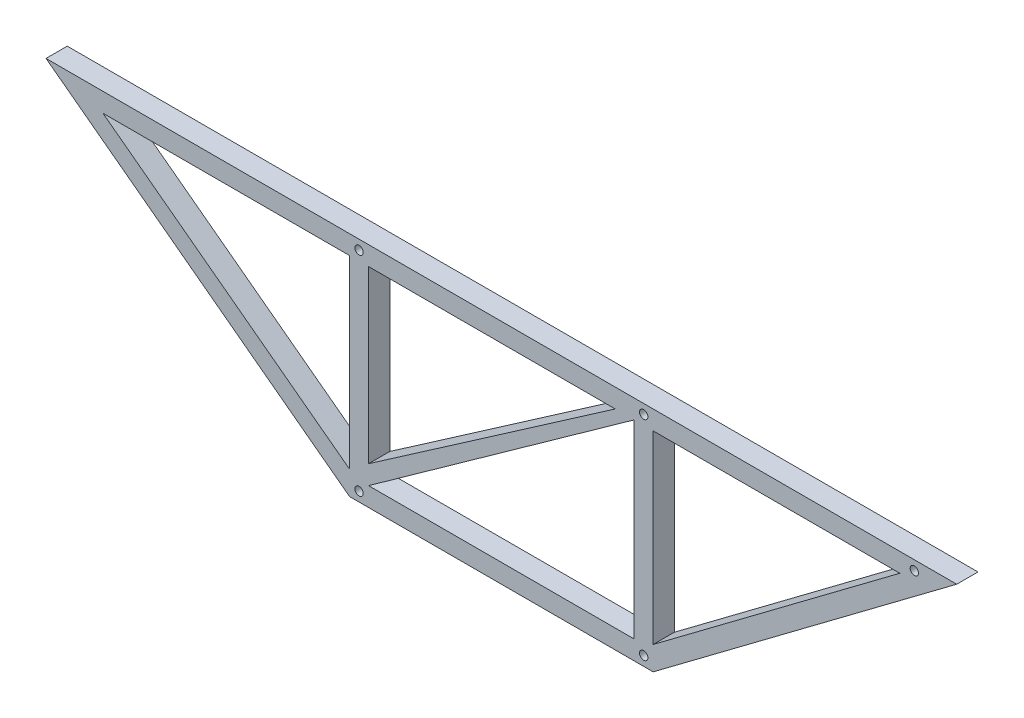
ISO-10303-21;
HEADER;
FILE_DESCRIPTION(('STEP AP214'),'2;1');
FILE_NAME('part.step','',(''),(''),'','','');
FILE_SCHEMA(('AUTOMOTIVE_DESIGN { 1 0 10303 214 1 1 1 1 }'));
ENDSEC;
DATA;
#1=APPLICATION_CONTEXT('core data for automotive mechanical design processes');
#2=APPLICATION_PROTOCOL_DEFINITION('international standard','automotive_design',2000,#1);
#3=PRODUCT_CONTEXT('',#1,'mechanical');
#4=PRODUCT('Part','Part','',(#3));
#5=PRODUCT_RELATED_PRODUCT_CATEGORY('part','',(#4));
#6=PRODUCT_DEFINITION_FORMATION('','',#4);
#7=PRODUCT_DEFINITION_CONTEXT('part definition',#1,'design');
#8=PRODUCT_DEFINITION('design','',#6,#7);
#9=PRODUCT_DEFINITION_SHAPE('','',#8);
#10=(LENGTH_UNIT() NAMED_UNIT(*) SI_UNIT(.MILLI.,.METRE.));
#11=(NAMED_UNIT(*) PLANE_ANGLE_UNIT() SI_UNIT($,.RADIAN.));
#12=(NAMED_UNIT(*) SI_UNIT($,.STERADIAN.) SOLID_ANGLE_UNIT());
#13=UNCERTAINTY_MEASURE_WITH_UNIT(LENGTH_MEASURE(1.E-05),#10,'distance_accuracy_value','');
#14=(GEOMETRIC_REPRESENTATION_CONTEXT(3) GLOBAL_UNCERTAINTY_ASSIGNED_CONTEXT((#13)) GLOBAL_UNIT_ASSIGNED_CONTEXT((#10,
#11,#12)) REPRESENTATION_CONTEXT('',''));
#15=CARTESIAN_POINT('',(0.,0.,0.));
#16=DIRECTION('',(0.,0.,1.));
#17=DIRECTION('',(1.,0.,0.));
#18=AXIS2_PLACEMENT_3D('',#15,#16,#17);
#19=CARTESIAN_POINT('',(200.,-300.,14.));
#20=DIRECTION('',(-0.6,0.8,0.));
#21=DIRECTION('',(-0.8,-0.6,0.));
#22=AXIS2_PLACEMENT_3D('',#19,#20,#21);
#23=PLANE('',#22);
#24=DIRECTION('',(0.8,0.6,0.));
#25=VECTOR('',#24,1.);
#26=CARTESIAN_POINT('',(200.,-300.,-14.));
#27=LINE('',#26,#25);
#28=CARTESIAN_POINT('',(200.,-300.,-14.));
#29=VERTEX_POINT('',#28);
#30=CARTESIAN_POINT('',(600.,0.,-14.));
#31=VERTEX_POINT('',#30);
#32=EDGE_CURVE('E292',#29,#31,#27,.T.);
#33=ORIENTED_EDGE('',*,*,#32,.T.);
#34=DIRECTION('',(0.,0.,-1.));
#35=VECTOR('',#34,1.);
#36=CARTESIAN_POINT('',(600.,0.,14.));
#37=LINE('',#36,#35);
#38=CARTESIAN_POINT('',(600.,0.,14.));
#39=VERTEX_POINT('',#38);
#40=EDGE_CURVE('E11',#39,#31,#37,.T.);
#41=ORIENTED_EDGE('',*,*,#40,.F.);
#42=DIRECTION('',(0.8,0.6,0.));
#43=VECTOR('',#42,1.);
#44=CARTESIAN_POINT('',(200.,-300.,14.));
#45=LINE('',#44,#43);
#46=CARTESIAN_POINT('',(200.,-300.,14.));
#47=VERTEX_POINT('',#46);
#48=EDGE_CURVE('E297',#47,#39,#45,.T.);
#49=ORIENTED_EDGE('',*,*,#48,.F.);
#50=DIRECTION('',(0.,0.,-1.));
#51=VECTOR('',#50,1.);
#52=CARTESIAN_POINT('',(200.,-300.,14.));
#53=LINE('',#52,#51);
#54=EDGE_CURVE('E315',#47,#29,#53,.T.);
#55=ORIENTED_EDGE('',*,*,#54,.T.);
#56=EDGE_LOOP('',(#33,#41,#49,#55));
#57=FACE_BOUND('',#56,.T.);
#58=ADVANCED_FACE('F44',(#57),#23,.F.);
#59=CARTESIAN_POINT('',(-600.,0.,14.));
#60=DIRECTION('',(0.,-1.,0.));
#61=DIRECTION('',(0.,0.,-1.));
#62=AXIS2_PLACEMENT_3D('',#59,#60,#61);
#63=PLANE('',#62);
#64=DIRECTION('',(-1.,0.,0.));
#65=VECTOR('',#64,1.);
#66=CARTESIAN_POINT('',(-600.,0.,-14.));
#67=LINE('',#66,#65);
#68=CARTESIAN_POINT('',(-600.,0.,-14.));
#69=VERTEX_POINT('',#68);
#70=EDGE_CURVE('E316',#31,#69,#67,.T.);
#71=ORIENTED_EDGE('',*,*,#70,.T.);
#72=DIRECTION('',(0.,0.,-1.));
#73=VECTOR('',#72,1.);
#74=CARTESIAN_POINT('',(-600.,0.,14.));
#75=LINE('',#74,#73);
#76=CARTESIAN_POINT('',(-600.,0.,14.));
#77=VERTEX_POINT('',#76);
#78=EDGE_CURVE('E52',#77,#69,#75,.T.);
#79=ORIENTED_EDGE('',*,*,#78,.F.);
#80=DIRECTION('',(-1.,0.,0.));
#81=VECTOR('',#80,1.);
#82=CARTESIAN_POINT('',(-600.,0.,14.));
#83=LINE('',#82,#81);
#84=EDGE_CURVE('E304',#39,#77,#83,.T.);
#85=ORIENTED_EDGE('',*,*,#84,.F.);
#86=ORIENTED_EDGE('',*,*,#40,.T.);
#87=EDGE_LOOP('',(#71,#79,#85,#86));
#88=FACE_BOUND('',#87,.T.);
#89=ADVANCED_FACE('F353',(#88),#63,.F.);
#90=CARTESIAN_POINT('',(-600.,0.,14.));
#91=DIRECTION('',(0.6,0.8,0.));
#92=DIRECTION('',(-0.8,0.6,0.));
#93=AXIS2_PLACEMENT_3D('',#90,#91,#92);
#94=PLANE('',#93);
#95=DIRECTION('',(0.8,-0.6,0.));
#96=VECTOR('',#95,1.);
#97=CARTESIAN_POINT('',(-600.,0.,-14.));
#98=LINE('',#97,#96);
#99=CARTESIAN_POINT('',(-200.,-300.,-14.));
#100=VERTEX_POINT('',#99);
#101=EDGE_CURVE('E317',#69,#100,#98,.T.);
#102=ORIENTED_EDGE('',*,*,#101,.T.);
#103=DIRECTION('',(0.,0.,-1.));
#104=VECTOR('',#103,1.);
#105=CARTESIAN_POINT('',(-200.,-300.,14.));
#106=LINE('',#105,#104);
#107=CARTESIAN_POINT('',(-200.,-300.,14.));
#108=VERTEX_POINT('',#107);
#109=EDGE_CURVE('E330',#108,#100,#106,.T.);
#110=ORIENTED_EDGE('',*,*,#109,.F.);
#111=DIRECTION('',(0.8,-0.6,0.));
#112=VECTOR('',#111,1.);
#113=CARTESIAN_POINT('',(-600.,0.,14.));
#114=LINE('',#113,#112);
#115=EDGE_CURVE('E308',#77,#108,#114,.T.);
#116=ORIENTED_EDGE('',*,*,#115,.F.);
#117=ORIENTED_EDGE('',*,*,#78,.T.);
#118=EDGE_LOOP('',(#102,#110,#116,#117));
#119=FACE_BOUND('',#118,.T.);
#120=ADVANCED_FACE('F338',(#119),#94,.F.);
#121=CARTESIAN_POINT('',(-200.,-300.,14.));
#122=DIRECTION('',(0.,1.,0.));
#123=DIRECTION('',(0.,0.,1.));
#124=AXIS2_PLACEMENT_3D('',#121,#122,#123);
#125=PLANE('',#124);
#126=DIRECTION('',(1.,0.,0.));
#127=VECTOR('',#126,1.);
#128=CARTESIAN_POINT('',(-200.,-300.,-14.));
#129=LINE('',#128,#127);
#130=EDGE_CURVE('E302',#100,#29,#129,.T.);
#131=ORIENTED_EDGE('',*,*,#130,.T.);
#132=ORIENTED_EDGE('',*,*,#54,.F.);
#133=DIRECTION('',(1.,0.,0.));
#134=VECTOR('',#133,1.);
#135=CARTESIAN_POINT('',(-200.,-300.,14.));
#136=LINE('',#135,#134);
#137=EDGE_CURVE('E310',#108,#47,#136,.T.);
#138=ORIENTED_EDGE('',*,*,#137,.F.);
#139=ORIENTED_EDGE('',*,*,#109,.T.);
#140=EDGE_LOOP('',(#131,#132,#138,#139));
#141=FACE_BOUND('',#140,.T.);
#142=ADVANCED_FACE('F345',(#141),#125,.F.);
#143=CARTESIAN_POINT('',(0.,0.,14.));
#144=DIRECTION('',(0.,0.,-1.));
#145=DIRECTION('',(-1.,0.,0.));
#146=AXIS2_PLACEMENT_3D('',#143,#144,#145);
#147=PLANE('',#146);
#148=CARTESIAN_POINT('',(544.11011125979,-12.5,14.));
#149=DIRECTION('',(0.,0.,1.));
#150=DIRECTION('',(1.,0.,0.));
#151=AXIS2_PLACEMENT_3D('',#148,#149,#150);
#152=CIRCLE('',#151,5.49999999999996);
#153=CARTESIAN_POINT('',(549.61011125979,-12.5,14.));
#154=VERTEX_POINT('',#153);
#155=EDGE_CURVE('E464',#154,#154,#152,.T.);
#156=ORIENTED_EDGE('',*,*,#155,.F.);
#157=EDGE_LOOP('',(#156));
#158=FACE_BOUND('',#157,.T.);
#159=CARTESIAN_POINT('',(187.5,-12.5,14.));
#160=DIRECTION('',(0.,0.,1.));
#161=DIRECTION('',(1.,0.,0.));
#162=AXIS2_PLACEMENT_3D('',#159,#160,#161);
#163=CIRCLE('',#162,5.50000000000002);
#164=CARTESIAN_POINT('',(193.,-12.5,14.));
#165=VERTEX_POINT('',#164);
#166=EDGE_CURVE('E455',#165,#165,#163,.T.);
#167=ORIENTED_EDGE('',*,*,#166,.F.);
#168=EDGE_LOOP('',(#167));
#169=FACE_BOUND('',#168,.T.);
#170=CARTESIAN_POINT('',(187.5,-287.5,14.));
#171=DIRECTION('',(0.,0.,1.));
#172=DIRECTION('',(1.,0.,0.));
#173=AXIS2_PLACEMENT_3D('',#170,#171,#172);
#174=CIRCLE('',#173,5.50000000000002);
#175=CARTESIAN_POINT('',(193.,-287.5,14.));
#176=VERTEX_POINT('',#175);
#177=EDGE_CURVE('E441',#176,#176,#174,.T.);
#178=ORIENTED_EDGE('',*,*,#177,.F.);
#179=EDGE_LOOP('',(#178));
#180=FACE_BOUND('',#179,.T.);
#181=CARTESIAN_POINT('',(-187.5,-287.5,14.));
#182=DIRECTION('',(0.,0.,1.));
#183=DIRECTION('',(1.,0.,0.));
#184=AXIS2_PLACEMENT_3D('',#181,#182,#183);
#185=CIRCLE('',#184,5.50000000000002);
#186=CARTESIAN_POINT('',(-182.,-287.5,14.));
#187=VERTEX_POINT('',#186);
#188=EDGE_CURVE('E440',#187,#187,#185,.T.);
#189=ORIENTED_EDGE('',*,*,#188,.F.);
#190=EDGE_LOOP('',(#189));
#191=FACE_BOUND('',#190,.T.);
#192=CARTESIAN_POINT('',(-187.5,-12.5,14.));
#193=DIRECTION('',(0.,0.,1.));
#194=DIRECTION('',(1.,0.,0.));
#195=AXIS2_PLACEMENT_3D('',#192,#193,#194);
#196=CIRCLE('',#195,5.50000000000002);
#197=CARTESIAN_POINT('',(-182.,-12.5,14.));
#198=VERTEX_POINT('',#197);
#199=EDGE_CURVE('E181',#198,#198,#196,.T.);
#200=ORIENTED_EDGE('',*,*,#199,.F.);
#201=EDGE_LOOP('',(#200));
#202=FACE_BOUND('',#201,.T.);
#203=DIRECTION('',(0.8,0.6,0.));
#204=VECTOR('',#203,1.);
#205=CARTESIAN_POINT('',(525.,-25.,14.));
#206=LINE('',#205,#204);
#207=CARTESIAN_POINT('',(200.,-268.75,14.));
#208=VERTEX_POINT('',#207);
#209=CARTESIAN_POINT('',(525.,-25.,14.));
#210=VERTEX_POINT('',#209);
#211=EDGE_CURVE('E176',#208,#210,#206,.T.);
#212=ORIENTED_EDGE('',*,*,#211,.F.);
#213=DIRECTION('',(0.,-1.,0.));
#214=VECTOR('',#213,1.);
#215=CARTESIAN_POINT('',(200.,-268.75,14.));
#216=LINE('',#215,#214);
#217=CARTESIAN_POINT('',(200.,-25.,14.));
#218=VERTEX_POINT('',#217);
#219=EDGE_CURVE('E58',#218,#208,#216,.T.);
#220=ORIENTED_EDGE('',*,*,#219,.F.);
#221=DIRECTION('',(-1.,0.,0.));
#222=VECTOR('',#221,1.);
#223=CARTESIAN_POINT('',(200.,-25.,14.));
#224=LINE('',#223,#222);
#225=EDGE_CURVE('E178',#210,#218,#224,.T.);
#226=ORIENTED_EDGE('',*,*,#225,.F.);
#227=EDGE_LOOP('',(#212,#220,#226));
#228=FACE_BOUND('',#227,.T.);
#229=DIRECTION('',(0.,1.,0.));
#230=VECTOR('',#229,1.);
#231=CARTESIAN_POINT('',(-200.,-25.,14.));
#232=LINE('',#231,#230);
#233=CARTESIAN_POINT('',(-200.,-268.75,14.));
#234=VERTEX_POINT('',#233);
#235=CARTESIAN_POINT('',(-200.,-25.,14.));
#236=VERTEX_POINT('',#235);
#237=EDGE_CURVE('E214',#234,#236,#232,.T.);
#238=ORIENTED_EDGE('',*,*,#237,.F.);
#239=DIRECTION('',(0.8,-0.6,0.));
#240=VECTOR('',#239,1.);
#241=CARTESIAN_POINT('',(-200.,-268.75,14.));
#242=LINE('',#241,#240);
#243=CARTESIAN_POINT('',(-525.,-25.,14.));
#244=VERTEX_POINT('',#243);
#245=EDGE_CURVE('E198',#244,#234,#242,.T.);
#246=ORIENTED_EDGE('',*,*,#245,.F.);
#247=DIRECTION('',(-1.,0.,0.));
#248=VECTOR('',#247,1.);
#249=CARTESIAN_POINT('',(-525.,-25.,14.));
#250=LINE('',#249,#248);
#251=EDGE_CURVE('E204',#236,#244,#250,.T.);
#252=ORIENTED_EDGE('',*,*,#251,.F.);
#253=EDGE_LOOP('',(#238,#246,#252));
#254=FACE_BOUND('',#253,.T.);
#255=DIRECTION('',(0.,-1.,0.));
#256=VECTOR('',#255,1.);
#257=CARTESIAN_POINT('',(-175.,-25.,14.));
#258=LINE('',#257,#256);
#259=CARTESIAN_POINT('',(-175.,-25.,14.));
#260=VERTEX_POINT('',#259);
#261=CARTESIAN_POINT('',(-175.,-250.,14.));
#262=VERTEX_POINT('',#261);
#263=EDGE_CURVE('E248',#260,#262,#258,.T.);
#264=ORIENTED_EDGE('',*,*,#263,.F.);
#265=DIRECTION('',(-1.,0.,0.));
#266=VECTOR('',#265,1.);
#267=CARTESIAN_POINT('',(-175.,-25.,14.));
#268=LINE('',#267,#266);
#269=CARTESIAN_POINT('',(150.,-25.,14.));
#270=VERTEX_POINT('',#269);
#271=EDGE_CURVE('E253',#270,#260,#268,.T.);
#272=ORIENTED_EDGE('',*,*,#271,.F.);
#273=DIRECTION('',(0.822192191643779,0.569209978830308,0.));
#274=VECTOR('',#273,1.);
#275=CARTESIAN_POINT('',(150.,-25.,14.));
#276=LINE('',#275,#274);
#277=EDGE_CURVE('E244',#262,#270,#276,.T.);
#278=ORIENTED_EDGE('',*,*,#277,.F.);
#279=EDGE_LOOP('',(#264,#272,#278));
#280=FACE_BOUND('',#279,.T.);
#281=DIRECTION('',(1.,0.,0.));
#282=VECTOR('',#281,1.);
#283=CARTESIAN_POINT('',(-175.,-275.,14.));
#284=LINE('',#283,#282);
#285=CARTESIAN_POINT('',(-175.,-275.,14.));
#286=VERTEX_POINT('',#285);
#287=CARTESIAN_POINT('',(175.,-275.,14.));
#288=VERTEX_POINT('',#287);
#289=EDGE_CURVE('E283',#286,#288,#284,.T.);
#290=ORIENTED_EDGE('',*,*,#289,.F.);
#291=DIRECTION('',(-0.813733471206735,-0.581238193719096,0.));
#292=VECTOR('',#291,1.);
#293=CARTESIAN_POINT('',(175.,-25.,14.));
#294=LINE('',#293,#292);
#295=CARTESIAN_POINT('',(175.,-25.,14.));
#296=VERTEX_POINT('',#295);
#297=EDGE_CURVE('E255',#296,#286,#294,.T.);
#298=ORIENTED_EDGE('',*,*,#297,.F.);
#299=DIRECTION('',(0.,1.,0.));
#300=VECTOR('',#299,1.);
#301=CARTESIAN_POINT('',(175.,-275.,14.));
#302=LINE('',#301,#300);
#303=EDGE_CURVE('E269',#288,#296,#302,.T.);
#304=ORIENTED_EDGE('',*,*,#303,.F.);
#305=EDGE_LOOP('',(#290,#298,#304));
#306=FACE_BOUND('',#305,.T.);
#307=ORIENTED_EDGE('',*,*,#48,.T.);
#308=ORIENTED_EDGE('',*,*,#84,.T.);
#309=ORIENTED_EDGE('',*,*,#115,.T.);
#310=ORIENTED_EDGE('',*,*,#137,.T.);
#311=EDGE_LOOP('',(#307,#308,#309,#310));
#312=FACE_BOUND('',#311,.T.);
#313=ADVANCED_FACE('F348',(#158,#169,#180,#191,#202,#228,#254,#280,#306,#312),#147,.F.);
#314=CARTESIAN_POINT('',(0.,0.,-14.));
#315=DIRECTION('',(0.,0.,-1.));
#316=DIRECTION('',(-1.,0.,0.));
#317=AXIS2_PLACEMENT_3D('',#314,#315,#316);
#318=PLANE('',#317);
#319=CARTESIAN_POINT('',(544.11011125979,-12.5,-14.));
#320=DIRECTION('',(0.,0.,1.));
#321=DIRECTION('',(1.,0.,0.));
#322=AXIS2_PLACEMENT_3D('',#319,#320,#321);
#323=CIRCLE('',#322,5.49999999999996);
#324=CARTESIAN_POINT('',(549.61011125979,-12.5,-14.));
#325=VERTEX_POINT('',#324);
#326=EDGE_CURVE('E468',#325,#325,#323,.T.);
#327=ORIENTED_EDGE('',*,*,#326,.T.);
#328=EDGE_LOOP('',(#327));
#329=FACE_BOUND('',#328,.T.);
#330=CARTESIAN_POINT('',(187.5,-12.5,-14.));
#331=DIRECTION('',(0.,0.,1.));
#332=DIRECTION('',(1.,0.,0.));
#333=AXIS2_PLACEMENT_3D('',#330,#331,#332);
#334=CIRCLE('',#333,5.50000000000002);
#335=CARTESIAN_POINT('',(193.,-12.5,-14.));
#336=VERTEX_POINT('',#335);
#337=EDGE_CURVE('E456',#336,#336,#334,.T.);
#338=ORIENTED_EDGE('',*,*,#337,.T.);
#339=EDGE_LOOP('',(#338));
#340=FACE_BOUND('',#339,.T.);
#341=CARTESIAN_POINT('',(187.5,-287.5,-14.));
#342=DIRECTION('',(0.,0.,1.));
#343=DIRECTION('',(1.,0.,0.));
#344=AXIS2_PLACEMENT_3D('',#341,#342,#343);
#345=CIRCLE('',#344,5.50000000000002);
#346=CARTESIAN_POINT('',(193.,-287.5,-14.));
#347=VERTEX_POINT('',#346);
#348=EDGE_CURVE('E446',#347,#347,#345,.T.);
#349=ORIENTED_EDGE('',*,*,#348,.T.);
#350=EDGE_LOOP('',(#349));
#351=FACE_BOUND('',#350,.T.);
#352=CARTESIAN_POINT('',(-187.5,-287.5,-14.));
#353=DIRECTION('',(0.,0.,1.));
#354=DIRECTION('',(1.,0.,0.));
#355=AXIS2_PLACEMENT_3D('',#352,#353,#354);
#356=CIRCLE('',#355,5.50000000000002);
#357=CARTESIAN_POINT('',(-182.,-287.5,-14.));
#358=VERTEX_POINT('',#357);
#359=EDGE_CURVE('E432',#358,#358,#356,.T.);
#360=ORIENTED_EDGE('',*,*,#359,.T.);
#361=EDGE_LOOP('',(#360));
#362=FACE_BOUND('',#361,.T.);
#363=CARTESIAN_POINT('',(-187.5,-12.5,-14.));
#364=DIRECTION('',(0.,0.,1.));
#365=DIRECTION('',(1.,0.,0.));
#366=AXIS2_PLACEMENT_3D('',#363,#364,#365);
#367=CIRCLE('',#366,5.50000000000002);
#368=CARTESIAN_POINT('',(-182.,-12.5,-14.));
#369=VERTEX_POINT('',#368);
#370=EDGE_CURVE('E186',#369,#369,#367,.T.);
#371=ORIENTED_EDGE('',*,*,#370,.T.);
#372=EDGE_LOOP('',(#371));
#373=FACE_BOUND('',#372,.T.);
#374=DIRECTION('',(0.,-1.,0.));
#375=VECTOR('',#374,1.);
#376=CARTESIAN_POINT('',(200.,-268.75,-14.));
#377=LINE('',#376,#375);
#378=CARTESIAN_POINT('',(200.,-25.,-14.));
#379=VERTEX_POINT('',#378);
#380=CARTESIAN_POINT('',(200.,-268.75,-14.));
#381=VERTEX_POINT('',#380);
#382=EDGE_CURVE('E159',#379,#381,#377,.T.);
#383=ORIENTED_EDGE('',*,*,#382,.T.);
#384=DIRECTION('',(0.8,0.6,0.));
#385=VECTOR('',#384,1.);
#386=CARTESIAN_POINT('',(525.,-25.,-14.));
#387=LINE('',#386,#385);
#388=CARTESIAN_POINT('',(525.,-25.,-14.));
#389=VERTEX_POINT('',#388);
#390=EDGE_CURVE('E169',#381,#389,#387,.T.);
#391=ORIENTED_EDGE('',*,*,#390,.T.);
#392=DIRECTION('',(-1.,0.,0.));
#393=VECTOR('',#392,1.);
#394=CARTESIAN_POINT('',(200.,-25.,-14.));
#395=LINE('',#394,#393);
#396=EDGE_CURVE('E67',#389,#379,#395,.T.);
#397=ORIENTED_EDGE('',*,*,#396,.T.);
#398=EDGE_LOOP('',(#383,#391,#397));
#399=FACE_BOUND('',#398,.T.);
#400=DIRECTION('',(0.8,-0.6,0.));
#401=VECTOR('',#400,1.);
#402=CARTESIAN_POINT('',(-200.,-268.75,-14.));
#403=LINE('',#402,#401);
#404=CARTESIAN_POINT('',(-525.,-25.,-14.));
#405=VERTEX_POINT('',#404);
#406=CARTESIAN_POINT('',(-200.,-268.75,-14.));
#407=VERTEX_POINT('',#406);
#408=EDGE_CURVE('E200',#405,#407,#403,.T.);
#409=ORIENTED_EDGE('',*,*,#408,.T.);
#410=DIRECTION('',(0.,1.,0.));
#411=VECTOR('',#410,1.);
#412=CARTESIAN_POINT('',(-200.,-25.,-14.));
#413=LINE('',#412,#411);
#414=CARTESIAN_POINT('',(-200.,-25.,-14.));
#415=VERTEX_POINT('',#414);
#416=EDGE_CURVE('E201',#407,#415,#413,.T.);
#417=ORIENTED_EDGE('',*,*,#416,.T.);
#418=DIRECTION('',(-1.,0.,0.));
#419=VECTOR('',#418,1.);
#420=CARTESIAN_POINT('',(-525.,-25.,-14.));
#421=LINE('',#420,#419);
#422=EDGE_CURVE('E208',#415,#405,#421,.T.);
#423=ORIENTED_EDGE('',*,*,#422,.T.);
#424=EDGE_LOOP('',(#409,#417,#423));
#425=FACE_BOUND('',#424,.T.);
#426=DIRECTION('',(-1.,0.,0.));
#427=VECTOR('',#426,1.);
#428=CARTESIAN_POINT('',(-175.,-25.,-14.));
#429=LINE('',#428,#427);
#430=CARTESIAN_POINT('',(150.,-25.,-14.));
#431=VERTEX_POINT('',#430);
#432=CARTESIAN_POINT('',(-175.,-25.,-14.));
#433=VERTEX_POINT('',#432);
#434=EDGE_CURVE('E249',#431,#433,#429,.T.);
#435=ORIENTED_EDGE('',*,*,#434,.T.);
#436=DIRECTION('',(0.,-1.,0.));
#437=VECTOR('',#436,1.);
#438=CARTESIAN_POINT('',(-175.,-25.,-14.));
#439=LINE('',#438,#437);
#440=CARTESIAN_POINT('',(-175.,-250.,-14.));
#441=VERTEX_POINT('',#440);
#442=EDGE_CURVE('E256',#433,#441,#439,.T.);
#443=ORIENTED_EDGE('',*,*,#442,.T.);
#444=DIRECTION('',(0.822192191643779,0.569209978830308,0.));
#445=VECTOR('',#444,1.);
#446=CARTESIAN_POINT('',(150.,-25.,-14.));
#447=LINE('',#446,#445);
#448=EDGE_CURVE('E237',#441,#431,#447,.T.);
#449=ORIENTED_EDGE('',*,*,#448,.T.);
#450=EDGE_LOOP('',(#435,#443,#449));
#451=FACE_BOUND('',#450,.T.);
#452=DIRECTION('',(-0.813733471206735,-0.581238193719096,0.));
#453=VECTOR('',#452,1.);
#454=CARTESIAN_POINT('',(175.,-25.,-14.));
#455=LINE('',#454,#453);
#456=CARTESIAN_POINT('',(175.,-25.,-14.));
#457=VERTEX_POINT('',#456);
#458=CARTESIAN_POINT('',(-175.,-275.,-14.));
#459=VERTEX_POINT('',#458);
#460=EDGE_CURVE('E264',#457,#459,#455,.T.);
#461=ORIENTED_EDGE('',*,*,#460,.T.);
#462=DIRECTION('',(1.,0.,0.));
#463=VECTOR('',#462,1.);
#464=CARTESIAN_POINT('',(-175.,-275.,-14.));
#465=LINE('',#464,#463);
#466=CARTESIAN_POINT('',(175.,-275.,-14.));
#467=VERTEX_POINT('',#466);
#468=EDGE_CURVE('E267',#459,#467,#465,.T.);
#469=ORIENTED_EDGE('',*,*,#468,.T.);
#470=DIRECTION('',(0.,1.,0.));
#471=VECTOR('',#470,1.);
#472=CARTESIAN_POINT('',(175.,-275.,-14.));
#473=LINE('',#472,#471);
#474=EDGE_CURVE('E273',#467,#457,#473,.T.);
#475=ORIENTED_EDGE('',*,*,#474,.T.);
#476=EDGE_LOOP('',(#461,#469,#475));
#477=FACE_BOUND('',#476,.T.);
#478=ORIENTED_EDGE('',*,*,#32,.F.);
#479=ORIENTED_EDGE('',*,*,#130,.F.);
#480=ORIENTED_EDGE('',*,*,#101,.F.);
#481=ORIENTED_EDGE('',*,*,#70,.F.);
#482=EDGE_LOOP('',(#478,#479,#480,#481));
#483=FACE_BOUND('',#482,.T.);
#484=ADVANCED_FACE('F172',(#329,#340,#351,#362,#373,#399,#425,#451,#477,#483),#318,.T.);
#485=CARTESIAN_POINT('',(175.,-25.,-14.));
#486=DIRECTION('',(-0.581238193719096,0.813733471206735,0.));
#487=DIRECTION('',(-0.813733471206735,-0.581238193719096,0.));
#488=AXIS2_PLACEMENT_3D('',#485,#486,#487);
#489=PLANE('',#488);
#490=ORIENTED_EDGE('',*,*,#297,.T.);
#491=DIRECTION('',(0.,0.,1.));
#492=VECTOR('',#491,1.);
#493=CARTESIAN_POINT('',(-175.,-275.,-14.));
#494=LINE('',#493,#492);
#495=EDGE_CURVE('E279',#459,#286,#494,.T.);
#496=ORIENTED_EDGE('',*,*,#495,.F.);
#497=ORIENTED_EDGE('',*,*,#460,.F.);
#498=DIRECTION('',(0.,0.,1.));
#499=VECTOR('',#498,1.);
#500=CARTESIAN_POINT('',(175.,-25.,-14.));
#501=LINE('',#500,#499);
#502=EDGE_CURVE('E287',#457,#296,#501,.T.);
#503=ORIENTED_EDGE('',*,*,#502,.T.);
#504=EDGE_LOOP('',(#490,#496,#497,#503));
#505=FACE_BOUND('',#504,.T.);
#506=ADVANCED_FACE('F361',(#505),#489,.F.);
#507=CARTESIAN_POINT('',(175.,-275.,-14.));
#508=DIRECTION('',(1.,0.,0.));
#509=DIRECTION('',(0.,0.,-1.));
#510=AXIS2_PLACEMENT_3D('',#507,#508,#509);
#511=PLANE('',#510);
#512=ORIENTED_EDGE('',*,*,#303,.T.);
#513=ORIENTED_EDGE('',*,*,#502,.F.);
#514=ORIENTED_EDGE('',*,*,#474,.F.);
#515=DIRECTION('',(0.,0.,1.));
#516=VECTOR('',#515,1.);
#517=CARTESIAN_POINT('',(175.,-275.,-14.));
#518=LINE('',#517,#516);
#519=EDGE_CURVE('E295',#467,#288,#518,.T.);
#520=ORIENTED_EDGE('',*,*,#519,.T.);
#521=EDGE_LOOP('',(#512,#513,#514,#520));
#522=FACE_BOUND('',#521,.T.);
#523=ADVANCED_FACE('F367',(#522),#511,.F.);
#524=CARTESIAN_POINT('',(-175.,-275.,-14.));
#525=DIRECTION('',(0.,-1.,0.));
#526=DIRECTION('',(0.,0.,-1.));
#527=AXIS2_PLACEMENT_3D('',#524,#525,#526);
#528=PLANE('',#527);
#529=ORIENTED_EDGE('',*,*,#289,.T.);
#530=ORIENTED_EDGE('',*,*,#519,.F.);
#531=ORIENTED_EDGE('',*,*,#468,.F.);
#532=ORIENTED_EDGE('',*,*,#495,.T.);
#533=EDGE_LOOP('',(#529,#530,#531,#532));
#534=FACE_BOUND('',#533,.T.);
#535=ADVANCED_FACE('F375',(#534),#528,.F.);
#536=CARTESIAN_POINT('',(-175.,-25.,-14.));
#537=DIRECTION('',(0.,1.,0.));
#538=DIRECTION('',(0.,0.,1.));
#539=AXIS2_PLACEMENT_3D('',#536,#537,#538);
#540=PLANE('',#539);
#541=ORIENTED_EDGE('',*,*,#271,.T.);
#542=DIRECTION('',(0.,0.,1.));
#543=VECTOR('',#542,1.);
#544=CARTESIAN_POINT('',(-175.,-25.,-14.));
#545=LINE('',#544,#543);
#546=EDGE_CURVE('E234',#433,#260,#545,.T.);
#547=ORIENTED_EDGE('',*,*,#546,.F.);
#548=ORIENTED_EDGE('',*,*,#434,.F.);
#549=DIRECTION('',(0.,0.,1.));
#550=VECTOR('',#549,1.);
#551=CARTESIAN_POINT('',(150.,-25.,-14.));
#552=LINE('',#551,#550);
#553=EDGE_CURVE('E223',#431,#270,#552,.T.);
#554=ORIENTED_EDGE('',*,*,#553,.T.);
#555=EDGE_LOOP('',(#541,#547,#548,#554));
#556=FACE_BOUND('',#555,.T.);
#557=ADVANCED_FACE('F374',(#556),#540,.F.);
#558=CARTESIAN_POINT('',(150.,-25.,-14.));
#559=DIRECTION('',(0.569209978830308,-0.822192191643779,0.));
#560=DIRECTION('',(0.822192191643779,0.569209978830308,0.));
#561=AXIS2_PLACEMENT_3D('',#558,#559,#560);
#562=PLANE('',#561);
#563=ORIENTED_EDGE('',*,*,#277,.T.);
#564=ORIENTED_EDGE('',*,*,#553,.F.);
#565=ORIENTED_EDGE('',*,*,#448,.F.);
#566=DIRECTION('',(0.,0.,1.));
#567=VECTOR('',#566,1.);
#568=CARTESIAN_POINT('',(-175.,-250.,-14.));
#569=LINE('',#568,#567);
#570=EDGE_CURVE('E240',#441,#262,#569,.T.);
#571=ORIENTED_EDGE('',*,*,#570,.T.);
#572=EDGE_LOOP('',(#563,#564,#565,#571));
#573=FACE_BOUND('',#572,.T.);
#574=ADVANCED_FACE('F379',(#573),#562,.F.);
#575=CARTESIAN_POINT('',(-175.,-25.,-14.));
#576=DIRECTION('',(-1.,0.,0.));
#577=DIRECTION('',(0.,0.,1.));
#578=AXIS2_PLACEMENT_3D('',#575,#576,#577);
#579=PLANE('',#578);
#580=ORIENTED_EDGE('',*,*,#263,.T.);
#581=ORIENTED_EDGE('',*,*,#570,.F.);
#582=ORIENTED_EDGE('',*,*,#442,.F.);
#583=ORIENTED_EDGE('',*,*,#546,.T.);
#584=EDGE_LOOP('',(#580,#581,#582,#583));
#585=FACE_BOUND('',#584,.T.);
#586=ADVANCED_FACE('F382',(#585),#579,.F.);
#587=CARTESIAN_POINT('',(-200.,-268.75,-14.));
#588=DIRECTION('',(-0.6,-0.8,0.));
#589=DIRECTION('',(0.8,-0.6,0.));
#590=AXIS2_PLACEMENT_3D('',#587,#588,#589);
#591=PLANE('',#590);
#592=ORIENTED_EDGE('',*,*,#245,.T.);
#593=DIRECTION('',(0.,0.,1.));
#594=VECTOR('',#593,1.);
#595=CARTESIAN_POINT('',(-200.,-268.75,-14.));
#596=LINE('',#595,#594);
#597=EDGE_CURVE('E215',#407,#234,#596,.T.);
#598=ORIENTED_EDGE('',*,*,#597,.F.);
#599=ORIENTED_EDGE('',*,*,#408,.F.);
#600=DIRECTION('',(0.,0.,1.));
#601=VECTOR('',#600,1.);
#602=CARTESIAN_POINT('',(-525.,-25.,-14.));
#603=LINE('',#602,#601);
#604=EDGE_CURVE('E225',#405,#244,#603,.T.);
#605=ORIENTED_EDGE('',*,*,#604,.T.);
#606=EDGE_LOOP('',(#592,#598,#599,#605));
#607=FACE_BOUND('',#606,.T.);
#608=ADVANCED_FACE('F390',(#607),#591,.F.);
#609=CARTESIAN_POINT('',(-525.,-25.,-14.));
#610=DIRECTION('',(0.,1.,0.));
#611=DIRECTION('',(0.,0.,1.));
#612=AXIS2_PLACEMENT_3D('',#609,#610,#611);
#613=PLANE('',#612);
#614=ORIENTED_EDGE('',*,*,#251,.T.);
#615=ORIENTED_EDGE('',*,*,#604,.F.);
#616=ORIENTED_EDGE('',*,*,#422,.F.);
#617=DIRECTION('',(0.,0.,1.));
#618=VECTOR('',#617,1.);
#619=CARTESIAN_POINT('',(-200.,-25.,-14.));
#620=LINE('',#619,#618);
#621=EDGE_CURVE('E228',#415,#236,#620,.T.);
#622=ORIENTED_EDGE('',*,*,#621,.T.);
#623=EDGE_LOOP('',(#614,#615,#616,#622));
#624=FACE_BOUND('',#623,.T.);
#625=ADVANCED_FACE('F395',(#624),#613,.F.);
#626=CARTESIAN_POINT('',(-200.,-25.,-14.));
#627=DIRECTION('',(1.,0.,0.));
#628=DIRECTION('',(0.,1.,0.));
#629=AXIS2_PLACEMENT_3D('',#626,#627,#628);
#630=PLANE('',#629);
#631=ORIENTED_EDGE('',*,*,#237,.T.);
#632=ORIENTED_EDGE('',*,*,#621,.F.);
#633=ORIENTED_EDGE('',*,*,#416,.F.);
#634=ORIENTED_EDGE('',*,*,#597,.T.);
#635=EDGE_LOOP('',(#631,#632,#633,#634));
#636=FACE_BOUND('',#635,.T.);
#637=ADVANCED_FACE('F398',(#636),#630,.F.);
#638=CARTESIAN_POINT('',(200.,-268.75,-14.));
#639=DIRECTION('',(-1.,0.,0.));
#640=DIRECTION('',(0.,0.,1.));
#641=AXIS2_PLACEMENT_3D('',#638,#639,#640);
#642=PLANE('',#641);
#643=ORIENTED_EDGE('',*,*,#219,.T.);
#644=DIRECTION('',(0.,0.,1.));
#645=VECTOR('',#644,1.);
#646=CARTESIAN_POINT('',(200.,-268.75,-14.));
#647=LINE('',#646,#645);
#648=EDGE_CURVE('E156',#381,#208,#647,.T.);
#649=ORIENTED_EDGE('',*,*,#648,.F.);
#650=ORIENTED_EDGE('',*,*,#382,.F.);
#651=DIRECTION('',(0.,0.,1.));
#652=VECTOR('',#651,1.);
#653=CARTESIAN_POINT('',(200.,-25.,-14.));
#654=LINE('',#653,#652);
#655=EDGE_CURVE('E192',#379,#218,#654,.T.);
#656=ORIENTED_EDGE('',*,*,#655,.T.);
#657=EDGE_LOOP('',(#643,#649,#650,#656));
#658=FACE_BOUND('',#657,.T.);
#659=ADVANCED_FACE('F158',(#658),#642,.F.);
#660=CARTESIAN_POINT('',(200.,-25.,-14.));
#661=DIRECTION('',(0.,1.,0.));
#662=DIRECTION('',(-1.,0.,0.));
#663=AXIS2_PLACEMENT_3D('',#660,#661,#662);
#664=PLANE('',#663);
#665=ORIENTED_EDGE('',*,*,#225,.T.);
#666=ORIENTED_EDGE('',*,*,#655,.F.);
#667=ORIENTED_EDGE('',*,*,#396,.F.);
#668=DIRECTION('',(0.,0.,1.));
#669=VECTOR('',#668,1.);
#670=CARTESIAN_POINT('',(525.,-25.,-14.));
#671=LINE('',#670,#669);
#672=EDGE_CURVE('E164',#389,#210,#671,.T.);
#673=ORIENTED_EDGE('',*,*,#672,.T.);
#674=EDGE_LOOP('',(#665,#666,#667,#673));
#675=FACE_BOUND('',#674,.T.);
#676=ADVANCED_FACE('F403',(#675),#664,.F.);
#677=CARTESIAN_POINT('',(525.,-25.,-14.));
#678=DIRECTION('',(0.6,-0.8,0.));
#679=DIRECTION('',(0.8,0.6,0.));
#680=AXIS2_PLACEMENT_3D('',#677,#678,#679);
#681=PLANE('',#680);
#682=ORIENTED_EDGE('',*,*,#211,.T.);
#683=ORIENTED_EDGE('',*,*,#672,.F.);
#684=ORIENTED_EDGE('',*,*,#390,.F.);
#685=ORIENTED_EDGE('',*,*,#648,.T.);
#686=EDGE_LOOP('',(#682,#683,#684,#685));
#687=FACE_BOUND('',#686,.T.);
#688=ADVANCED_FACE('F166',(#687),#681,.F.);
#689=CARTESIAN_POINT('',(-187.5,-12.5,-14.));
#690=DIRECTION('',(0.,0.,1.));
#691=DIRECTION('',(1.,0.,0.));
#692=AXIS2_PLACEMENT_3D('',#689,#690,#691);
#693=CYLINDRICAL_SURFACE('',#692,5.50000000000002);
#694=ORIENTED_EDGE('',*,*,#370,.F.);
#695=EDGE_LOOP('',(#694));
#696=FACE_BOUND('',#695,.T.);
#697=ORIENTED_EDGE('',*,*,#199,.T.);
#698=EDGE_LOOP('',(#697));
#699=FACE_BOUND('',#698,.T.);
#700=ADVANCED_FACE('F407',(#696,#699),#693,.F.);
#701=CARTESIAN_POINT('',(-187.5,-287.5,-14.));
#702=DIRECTION('',(0.,0.,1.));
#703=DIRECTION('',(1.,0.,0.));
#704=AXIS2_PLACEMENT_3D('',#701,#702,#703);
#705=CYLINDRICAL_SURFACE('',#704,5.50000000000002);
#706=ORIENTED_EDGE('',*,*,#359,.F.);
#707=EDGE_LOOP('',(#706));
#708=FACE_BOUND('',#707,.T.);
#709=ORIENTED_EDGE('',*,*,#188,.T.);
#710=EDGE_LOOP('',(#709));
#711=FACE_BOUND('',#710,.T.);
#712=ADVANCED_FACE('F412',(#708,#711),#705,.F.);
#713=CARTESIAN_POINT('',(187.5,-287.5,-14.));
#714=DIRECTION('',(0.,0.,1.));
#715=DIRECTION('',(1.,0.,0.));
#716=AXIS2_PLACEMENT_3D('',#713,#714,#715);
#717=CYLINDRICAL_SURFACE('',#716,5.50000000000002);
#718=ORIENTED_EDGE('',*,*,#348,.F.);
#719=EDGE_LOOP('',(#718));
#720=FACE_BOUND('',#719,.T.);
#721=ORIENTED_EDGE('',*,*,#177,.T.);
#722=EDGE_LOOP('',(#721));
#723=FACE_BOUND('',#722,.T.);
#724=ADVANCED_FACE('F425',(#720,#723),#717,.F.);
#725=CARTESIAN_POINT('',(187.5,-12.5,-14.));
#726=DIRECTION('',(0.,0.,1.));
#727=DIRECTION('',(1.,0.,0.));
#728=AXIS2_PLACEMENT_3D('',#725,#726,#727);
#729=CYLINDRICAL_SURFACE('',#728,5.50000000000002);
#730=ORIENTED_EDGE('',*,*,#337,.F.);
#731=EDGE_LOOP('',(#730));
#732=FACE_BOUND('',#731,.T.);
#733=ORIENTED_EDGE('',*,*,#166,.T.);
#734=EDGE_LOOP('',(#733));
#735=FACE_BOUND('',#734,.T.);
#736=ADVANCED_FACE('F416',(#732,#735),#729,.F.);
#737=CARTESIAN_POINT('',(544.11011125979,-12.5,-14.));
#738=DIRECTION('',(0.,0.,1.));
#739=DIRECTION('',(1.,0.,0.));
#740=AXIS2_PLACEMENT_3D('',#737,#738,#739);
#741=CYLINDRICAL_SURFACE('',#740,5.49999999999996);
#742=ORIENTED_EDGE('',*,*,#326,.F.);
#743=EDGE_LOOP('',(#742));
#744=FACE_BOUND('',#743,.T.);
#745=ORIENTED_EDGE('',*,*,#155,.T.);
#746=EDGE_LOOP('',(#745));
#747=FACE_BOUND('',#746,.T.);
#748=ADVANCED_FACE('F411',(#744,#747),#741,.F.);
#749=CLOSED_SHELL('',(#58,#89,#120,#142,#313,#484,#506,#523,#535,#557,#574,#586,#608,#625,#637,
#659,#676,#688,#700,#712,#724,#736,#748));
#750=MANIFOLD_SOLID_BREP('B2',#749);
#751=ADVANCED_BREP_SHAPE_REPRESENTATION('',(#18,#750),#14);
#752=SHAPE_DEFINITION_REPRESENTATION(#9,#751);
ENDSEC;
END-ISO-10303-21;
